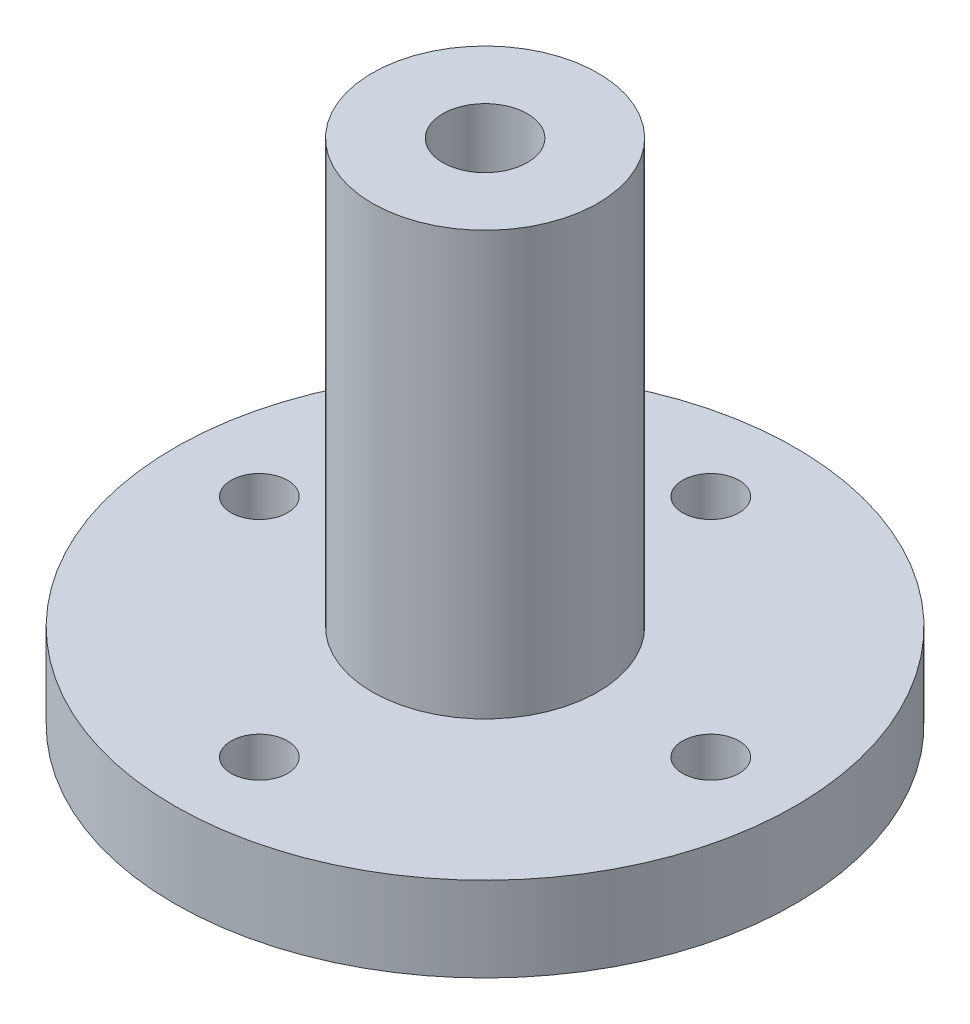
ISO-10303-21;
HEADER;
FILE_DESCRIPTION(('STEP AP214'),'2;1');
FILE_NAME('part.step','',(''),(''),'','','');
FILE_SCHEMA(('AUTOMOTIVE_DESIGN { 1 0 10303 214 1 1 1 1 }'));
ENDSEC;
DATA;
#1=APPLICATION_CONTEXT('core data for automotive mechanical design processes');
#2=APPLICATION_PROTOCOL_DEFINITION('international standard','automotive_design',2000,#1);
#3=PRODUCT_CONTEXT('',#1,'mechanical');
#4=PRODUCT('Part','Part','',(#3));
#5=PRODUCT_RELATED_PRODUCT_CATEGORY('part','',(#4));
#6=PRODUCT_DEFINITION_FORMATION('','',#4);
#7=PRODUCT_DEFINITION_CONTEXT('part definition',#1,'design');
#8=PRODUCT_DEFINITION('design','',#6,#7);
#9=PRODUCT_DEFINITION_SHAPE('','',#8);
#10=(LENGTH_UNIT() NAMED_UNIT(*) SI_UNIT(.MILLI.,.METRE.));
#11=(NAMED_UNIT(*) PLANE_ANGLE_UNIT() SI_UNIT($,.RADIAN.));
#12=(NAMED_UNIT(*) SI_UNIT($,.STERADIAN.) SOLID_ANGLE_UNIT());
#13=UNCERTAINTY_MEASURE_WITH_UNIT(LENGTH_MEASURE(1.E-05),#10,'distance_accuracy_value','');
#14=(GEOMETRIC_REPRESENTATION_CONTEXT(3) GLOBAL_UNCERTAINTY_ASSIGNED_CONTEXT((#13)) GLOBAL_UNIT_ASSIGNED_CONTEXT((#10,
#11,#12)) REPRESENTATION_CONTEXT('',''));
#15=CARTESIAN_POINT('',(0.,0.,0.));
#16=DIRECTION('',(0.,0.,1.));
#17=DIRECTION('',(1.,0.,0.));
#18=AXIS2_PLACEMENT_3D('',#15,#16,#17);
#19=CARTESIAN_POINT('',(0.,3.,0.));
#20=DIRECTION('',(0.,1.,0.));
#21=DIRECTION('',(0.,0.,1.));
#22=AXIS2_PLACEMENT_3D('',#19,#20,#21);
#23=PLANE('',#22);
#24=CARTESIAN_POINT('',(0.,3.,0.));
#25=DIRECTION('',(0.,1.,0.));
#26=DIRECTION('',(0.,0.,1.));
#27=AXIS2_PLACEMENT_3D('',#24,#25,#26);
#28=CIRCLE('',#27,4.);
#29=CARTESIAN_POINT('',(0.,3.,4.));
#30=VERTEX_POINT('',#29);
#31=EDGE_CURVE('E88',#30,#30,#28,.T.);
#32=ORIENTED_EDGE('',*,*,#31,.F.);
#33=EDGE_LOOP('',(#32));
#34=FACE_BOUND('',#33,.T.);
#35=CARTESIAN_POINT('',(0.,3.,8.));
#36=DIRECTION('',(0.,1.,0.));
#37=DIRECTION('',(0.,0.,1.));
#38=AXIS2_PLACEMENT_3D('',#35,#36,#37);
#39=CIRCLE('',#38,1.00000000000005);
#40=CARTESIAN_POINT('',(0.,3.,9.00000000000006));
#41=VERTEX_POINT('',#40);
#42=EDGE_CURVE('E68',#41,#41,#39,.T.);
#43=ORIENTED_EDGE('',*,*,#42,.F.);
#44=EDGE_LOOP('',(#43));
#45=FACE_BOUND('',#44,.T.);
#46=CARTESIAN_POINT('',(0.,3.,-8.));
#47=DIRECTION('',(0.,1.,0.));
#48=DIRECTION('',(0.,0.,1.));
#49=AXIS2_PLACEMENT_3D('',#46,#47,#48);
#50=CIRCLE('',#49,1.);
#51=CARTESIAN_POINT('',(0.,3.,-7.));
#52=VERTEX_POINT('',#51);
#53=EDGE_CURVE('E54',#52,#52,#50,.T.);
#54=ORIENTED_EDGE('',*,*,#53,.F.);
#55=EDGE_LOOP('',(#54));
#56=FACE_BOUND('',#55,.T.);
#57=CARTESIAN_POINT('',(0.,3.,0.));
#58=DIRECTION('',(0.,1.,0.));
#59=DIRECTION('',(0.,0.,1.));
#60=AXIS2_PLACEMENT_3D('',#57,#58,#59);
#61=CIRCLE('',#60,11.);
#62=CARTESIAN_POINT('',(0.,3.,11.));
#63=VERTEX_POINT('',#62);
#64=EDGE_CURVE('E10',#63,#63,#61,.T.);
#65=ORIENTED_EDGE('',*,*,#64,.T.);
#66=EDGE_LOOP('',(#65));
#67=FACE_BOUND('',#66,.T.);
#68=CARTESIAN_POINT('',(8.,3.,0.));
#69=DIRECTION('',(0.,1.,0.));
#70=DIRECTION('',(0.,0.,1.));
#71=AXIS2_PLACEMENT_3D('',#68,#69,#70);
#72=CIRCLE('',#71,1.00000000000003);
#73=CARTESIAN_POINT('',(8.,3.,1.00000000000003));
#74=VERTEX_POINT('',#73);
#75=EDGE_CURVE('E60',#74,#74,#72,.T.);
#76=ORIENTED_EDGE('',*,*,#75,.F.);
#77=EDGE_LOOP('',(#76));
#78=FACE_BOUND('',#77,.T.);
#79=CARTESIAN_POINT('',(-8.,3.,0.));
#80=DIRECTION('',(0.,1.,0.));
#81=DIRECTION('',(0.,0.,1.));
#82=AXIS2_PLACEMENT_3D('',#79,#80,#81);
#83=CIRCLE('',#82,1.00000000000008);
#84=CARTESIAN_POINT('',(-8.,3.,1.00000000000008));
#85=VERTEX_POINT('',#84);
#86=EDGE_CURVE('E76',#85,#85,#83,.T.);
#87=ORIENTED_EDGE('',*,*,#86,.F.);
#88=EDGE_LOOP('',(#87));
#89=FACE_BOUND('',#88,.T.);
#90=ADVANCED_FACE('F41',(#34,#45,#56,#67,#78,#89),#23,.T.);
#91=CARTESIAN_POINT('',(0.,0.,0.));
#92=DIRECTION('',(0.,1.,0.));
#93=DIRECTION('',(0.,0.,1.));
#94=AXIS2_PLACEMENT_3D('',#91,#92,#93);
#95=PLANE('',#94);
#96=CARTESIAN_POINT('',(0.,0.,0.));
#97=DIRECTION('',(0.,1.,0.));
#98=DIRECTION('',(0.,0.,1.));
#99=AXIS2_PLACEMENT_3D('',#96,#97,#98);
#100=CIRCLE('',#99,11.);
#101=CARTESIAN_POINT('',(0.,0.,11.));
#102=VERTEX_POINT('',#101);
#103=EDGE_CURVE('E45',#102,#102,#100,.T.);
#104=ORIENTED_EDGE('',*,*,#103,.F.);
#105=EDGE_LOOP('',(#104));
#106=FACE_BOUND('',#105,.T.);
#107=CARTESIAN_POINT('',(0.,0.,-8.));
#108=DIRECTION('',(0.,1.,0.));
#109=DIRECTION('',(0.,0.,1.));
#110=AXIS2_PLACEMENT_3D('',#107,#108,#109);
#111=CIRCLE('',#110,1.);
#112=CARTESIAN_POINT('',(0.,0.,-7.));
#113=VERTEX_POINT('',#112);
#114=EDGE_CURVE('E56',#113,#113,#111,.T.);
#115=ORIENTED_EDGE('',*,*,#114,.T.);
#116=EDGE_LOOP('',(#115));
#117=FACE_BOUND('',#116,.T.);
#118=CARTESIAN_POINT('',(8.,0.,0.));
#119=DIRECTION('',(0.,1.,0.));
#120=DIRECTION('',(0.,0.,1.));
#121=AXIS2_PLACEMENT_3D('',#118,#119,#120);
#122=CIRCLE('',#121,1.00000000000003);
#123=CARTESIAN_POINT('',(8.,0.,1.00000000000003));
#124=VERTEX_POINT('',#123);
#125=EDGE_CURVE('E64',#124,#124,#122,.T.);
#126=ORIENTED_EDGE('',*,*,#125,.T.);
#127=EDGE_LOOP('',(#126));
#128=FACE_BOUND('',#127,.T.);
#129=CARTESIAN_POINT('',(0.,0.,8.));
#130=DIRECTION('',(0.,1.,0.));
#131=DIRECTION('',(0.,0.,1.));
#132=AXIS2_PLACEMENT_3D('',#129,#130,#131);
#133=CIRCLE('',#132,1.00000000000005);
#134=CARTESIAN_POINT('',(0.,0.,9.00000000000006));
#135=VERTEX_POINT('',#134);
#136=EDGE_CURVE('E72',#135,#135,#133,.T.);
#137=ORIENTED_EDGE('',*,*,#136,.T.);
#138=EDGE_LOOP('',(#137));
#139=FACE_BOUND('',#138,.T.);
#140=CARTESIAN_POINT('',(-8.,0.,0.));
#141=DIRECTION('',(0.,1.,0.));
#142=DIRECTION('',(0.,0.,1.));
#143=AXIS2_PLACEMENT_3D('',#140,#141,#142);
#144=CIRCLE('',#143,1.00000000000008);
#145=CARTESIAN_POINT('',(-8.,0.,1.00000000000008));
#146=VERTEX_POINT('',#145);
#147=EDGE_CURVE('E80',#146,#146,#144,.T.);
#148=ORIENTED_EDGE('',*,*,#147,.T.);
#149=EDGE_LOOP('',(#148));
#150=FACE_BOUND('',#149,.T.);
#151=ADVANCED_FACE('F127',(#106,#117,#128,#139,#150),#95,.F.);
#152=CARTESIAN_POINT('',(0.,3.,0.));
#153=DIRECTION('',(0.,-1.,0.));
#154=DIRECTION('',(0.,0.,-1.));
#155=AXIS2_PLACEMENT_3D('',#152,#153,#154);
#156=CYLINDRICAL_SURFACE('',#155,11.);
#157=ORIENTED_EDGE('',*,*,#64,.F.);
#158=EDGE_LOOP('',(#157));
#159=FACE_BOUND('',#158,.T.);
#160=ORIENTED_EDGE('',*,*,#103,.T.);
#161=EDGE_LOOP('',(#160));
#162=FACE_BOUND('',#161,.T.);
#163=ADVANCED_FACE('F43',(#159,#162),#156,.T.);
#164=CARTESIAN_POINT('',(0.,3.,-8.));
#165=DIRECTION('',(0.,-1.,0.));
#166=DIRECTION('',(0.,0.,-1.));
#167=AXIS2_PLACEMENT_3D('',#164,#165,#166);
#168=CYLINDRICAL_SURFACE('',#167,1.);
#169=ORIENTED_EDGE('',*,*,#53,.T.);
#170=EDGE_LOOP('',(#169));
#171=FACE_BOUND('',#170,.T.);
#172=ORIENTED_EDGE('',*,*,#114,.F.);
#173=EDGE_LOOP('',(#172));
#174=FACE_BOUND('',#173,.T.);
#175=ADVANCED_FACE('F149',(#171,#174),#168,.F.);
#176=CARTESIAN_POINT('',(8.,3.,0.));
#177=DIRECTION('',(0.,-1.,0.));
#178=DIRECTION('',(0.,0.,-1.));
#179=AXIS2_PLACEMENT_3D('',#176,#177,#178);
#180=CYLINDRICAL_SURFACE('',#179,1.00000000000003);
#181=ORIENTED_EDGE('',*,*,#75,.T.);
#182=EDGE_LOOP('',(#181));
#183=FACE_BOUND('',#182,.T.);
#184=ORIENTED_EDGE('',*,*,#125,.F.);
#185=EDGE_LOOP('',(#184));
#186=FACE_BOUND('',#185,.T.);
#187=ADVANCED_FACE('F156',(#183,#186),#180,.F.);
#188=CARTESIAN_POINT('',(0.,3.,8.));
#189=DIRECTION('',(0.,-1.,0.));
#190=DIRECTION('',(0.,0.,-1.));
#191=AXIS2_PLACEMENT_3D('',#188,#189,#190);
#192=CYLINDRICAL_SURFACE('',#191,1.00000000000005);
#193=ORIENTED_EDGE('',*,*,#42,.T.);
#194=EDGE_LOOP('',(#193));
#195=FACE_BOUND('',#194,.T.);
#196=ORIENTED_EDGE('',*,*,#136,.F.);
#197=EDGE_LOOP('',(#196));
#198=FACE_BOUND('',#197,.T.);
#199=ADVANCED_FACE('F139',(#195,#198),#192,.F.);
#200=CARTESIAN_POINT('',(-8.,3.,0.));
#201=DIRECTION('',(0.,-1.,0.));
#202=DIRECTION('',(0.,0.,-1.));
#203=AXIS2_PLACEMENT_3D('',#200,#201,#202);
#204=CYLINDRICAL_SURFACE('',#203,1.00000000000008);
#205=ORIENTED_EDGE('',*,*,#86,.T.);
#206=EDGE_LOOP('',(#205));
#207=FACE_BOUND('',#206,.T.);
#208=ORIENTED_EDGE('',*,*,#147,.F.);
#209=EDGE_LOOP('',(#208));
#210=FACE_BOUND('',#209,.T.);
#211=ADVANCED_FACE('F121',(#207,#210),#204,.F.);
#212=CARTESIAN_POINT('',(0.,18.,0.));
#213=DIRECTION('',(0.,-1.,0.));
#214=DIRECTION('',(0.,0.,-1.));
#215=AXIS2_PLACEMENT_3D('',#212,#213,#214);
#216=CYLINDRICAL_SURFACE('',#215,4.);
#217=CARTESIAN_POINT('',(0.,18.,0.));
#218=DIRECTION('',(0.,1.,0.));
#219=DIRECTION('',(0.,0.,1.));
#220=AXIS2_PLACEMENT_3D('',#217,#218,#219);
#221=CIRCLE('',#220,4.);
#222=CARTESIAN_POINT('',(0.,18.,4.));
#223=VERTEX_POINT('',#222);
#224=EDGE_CURVE('E84',#223,#223,#221,.T.);
#225=ORIENTED_EDGE('',*,*,#224,.F.);
#226=EDGE_LOOP('',(#225));
#227=FACE_BOUND('',#226,.T.);
#228=ORIENTED_EDGE('',*,*,#31,.T.);
#229=EDGE_LOOP('',(#228));
#230=FACE_BOUND('',#229,.T.);
#231=ADVANCED_FACE('F115',(#227,#230),#216,.T.);
#232=CARTESIAN_POINT('',(0.,18.,0.));
#233=DIRECTION('',(0.,1.,0.));
#234=DIRECTION('',(0.,0.,1.));
#235=AXIS2_PLACEMENT_3D('',#232,#233,#234);
#236=PLANE('',#235);
#237=CARTESIAN_POINT('',(0.,18.,0.));
#238=DIRECTION('',(0.,1.,0.));
#239=DIRECTION('',(0.,0.,1.));
#240=AXIS2_PLACEMENT_3D('',#237,#238,#239);
#241=CIRCLE('',#240,1.5);
#242=CARTESIAN_POINT('',(0.,18.,1.5));
#243=VERTEX_POINT('',#242);
#244=EDGE_CURVE('E96',#243,#243,#241,.T.);
#245=ORIENTED_EDGE('',*,*,#244,.F.);
#246=EDGE_LOOP('',(#245));
#247=FACE_BOUND('',#246,.T.);
#248=ORIENTED_EDGE('',*,*,#224,.T.);
#249=EDGE_LOOP('',(#248));
#250=FACE_BOUND('',#249,.T.);
#251=ADVANCED_FACE('F109',(#247,#250),#236,.T.);
#252=CARTESIAN_POINT('',(0.,13.,0.));
#253=DIRECTION('',(0.,1.,0.));
#254=DIRECTION('',(0.,0.,1.));
#255=AXIS2_PLACEMENT_3D('',#252,#253,#254);
#256=CYLINDRICAL_SURFACE('',#255,1.5);
#257=CARTESIAN_POINT('',(0.,13.,0.));
#258=DIRECTION('',(0.,1.,0.));
#259=DIRECTION('',(0.,0.,1.));
#260=AXIS2_PLACEMENT_3D('',#257,#258,#259);
#261=CIRCLE('',#260,1.5);
#262=CARTESIAN_POINT('',(0.,13.,1.5));
#263=VERTEX_POINT('',#262);
#264=EDGE_CURVE('E92',#263,#263,#261,.T.);
#265=ORIENTED_EDGE('',*,*,#264,.F.);
#266=EDGE_LOOP('',(#265));
#267=FACE_BOUND('',#266,.T.);
#268=ORIENTED_EDGE('',*,*,#244,.T.);
#269=EDGE_LOOP('',(#268));
#270=FACE_BOUND('',#269,.T.);
#271=ADVANCED_FACE('F106',(#267,#270),#256,.F.);
#272=CARTESIAN_POINT('',(0.,13.,0.));
#273=DIRECTION('',(0.,1.,0.));
#274=DIRECTION('',(0.,0.,1.));
#275=AXIS2_PLACEMENT_3D('',#272,#273,#274);
#276=PLANE('',#275);
#277=ORIENTED_EDGE('',*,*,#264,.T.);
#278=EDGE_LOOP('',(#277));
#279=FACE_BOUND('',#278,.T.);
#280=ADVANCED_FACE('F104',(#279),#276,.T.);
#281=CLOSED_SHELL('',(#90,#151,#163,#175,#187,#199,#211,#231,#251,#271,#280));
#282=MANIFOLD_SOLID_BREP('B2',#281);
#283=ADVANCED_BREP_SHAPE_REPRESENTATION('',(#18,#282),#14);
#284=SHAPE_DEFINITION_REPRESENTATION(#9,#283);
ENDSEC;
END-ISO-10303-21;
